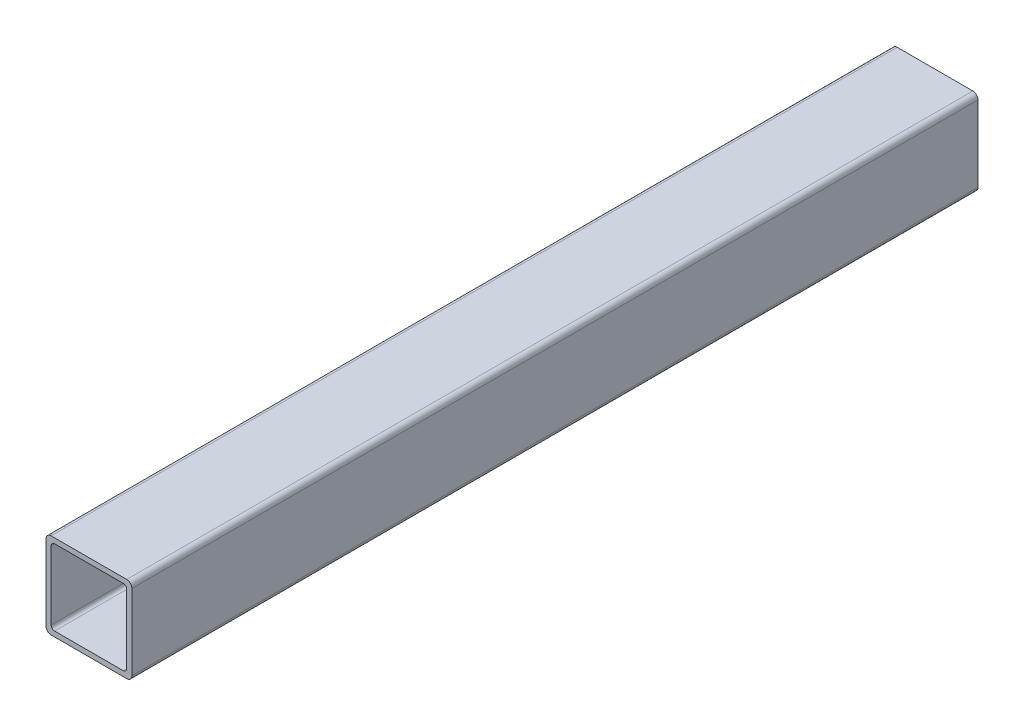
ISO-10303-21;
HEADER;
FILE_DESCRIPTION(('STEP AP214'),'2;1');
FILE_NAME('part.step','',(''),(''),'','','');
FILE_SCHEMA(('AUTOMOTIVE_DESIGN { 1 0 10303 214 1 1 1 1 }'));
ENDSEC;
DATA;
#1=APPLICATION_CONTEXT('core data for automotive mechanical design processes');
#2=APPLICATION_PROTOCOL_DEFINITION('international standard','automotive_design',2000,#1);
#3=PRODUCT_CONTEXT('',#1,'mechanical');
#4=PRODUCT('Part','Part','',(#3));
#5=PRODUCT_RELATED_PRODUCT_CATEGORY('part','',(#4));
#6=PRODUCT_DEFINITION_FORMATION('','',#4);
#7=PRODUCT_DEFINITION_CONTEXT('part definition',#1,'design');
#8=PRODUCT_DEFINITION('design','',#6,#7);
#9=PRODUCT_DEFINITION_SHAPE('','',#8);
#10=(LENGTH_UNIT() NAMED_UNIT(*) SI_UNIT(.MILLI.,.METRE.));
#11=(NAMED_UNIT(*) PLANE_ANGLE_UNIT() SI_UNIT($,.RADIAN.));
#12=(NAMED_UNIT(*) SI_UNIT($,.STERADIAN.) SOLID_ANGLE_UNIT());
#13=UNCERTAINTY_MEASURE_WITH_UNIT(LENGTH_MEASURE(1.E-05),#10,'distance_accuracy_value','');
#14=(GEOMETRIC_REPRESENTATION_CONTEXT(3) GLOBAL_UNCERTAINTY_ASSIGNED_CONTEXT((#13)) GLOBAL_UNIT_ASSIGNED_CONTEXT((#10,
#11,#12)) REPRESENTATION_CONTEXT('',''));
#15=CARTESIAN_POINT('',(0.,0.,0.));
#16=DIRECTION('',(0.,0.,1.));
#17=DIRECTION('',(1.,0.,0.));
#18=AXIS2_PLACEMENT_3D('',#15,#16,#17);
#19=CARTESIAN_POINT('',(-22.,3.,-492.500000000008));
#20=DIRECTION('',(0.,0.,1.));
#21=DIRECTION('',(1.,0.,0.));
#22=AXIS2_PLACEMENT_3D('',#19,#20,#21);
#23=CYLINDRICAL_SURFACE('',#22,3.);
#24=CARTESIAN_POINT('',(-22.,3.,0.));
#25=DIRECTION('',(0.,0.,1.));
#26=DIRECTION('',(1.,0.,0.));
#27=AXIS2_PLACEMENT_3D('',#24,#25,#26);
#28=CIRCLE('',#27,3.);
#29=CARTESIAN_POINT('',(-25.,3.,0.));
#30=VERTEX_POINT('',#29);
#31=CARTESIAN_POINT('',(-22.,0.,0.));
#32=VERTEX_POINT('',#31);
#33=EDGE_CURVE('E205',#30,#32,#28,.T.);
#34=ORIENTED_EDGE('',*,*,#33,.F.);
#35=DIRECTION('',(0.,0.,1.));
#36=VECTOR('',#35,1.);
#37=CARTESIAN_POINT('',(-25.,3.,-492.500000000008));
#38=LINE('',#37,#36);
#39=CARTESIAN_POINT('',(-25.,3.,-492.500000000008));
#40=VERTEX_POINT('',#39);
#41=EDGE_CURVE('E11',#40,#30,#38,.T.);
#42=ORIENTED_EDGE('',*,*,#41,.F.);
#43=CARTESIAN_POINT('',(-22.,3.,-492.500000000008));
#44=DIRECTION('',(0.,0.,1.));
#45=DIRECTION('',(1.,0.,0.));
#46=AXIS2_PLACEMENT_3D('',#43,#44,#45);
#47=CIRCLE('',#46,3.);
#48=CARTESIAN_POINT('',(-22.,0.,-492.500000000008));
#49=VERTEX_POINT('',#48);
#50=EDGE_CURVE('E217',#40,#49,#47,.T.);
#51=ORIENTED_EDGE('',*,*,#50,.T.);
#52=DIRECTION('',(0.,0.,1.));
#53=VECTOR('',#52,1.);
#54=CARTESIAN_POINT('',(-22.,0.,-492.500000000008));
#55=LINE('',#54,#53);
#56=EDGE_CURVE('E38',#49,#32,#55,.T.);
#57=ORIENTED_EDGE('',*,*,#56,.T.);
#58=EDGE_LOOP('',(#34,#42,#51,#57));
#59=FACE_BOUND('',#58,.T.);
#60=ADVANCED_FACE('F35',(#59),#23,.T.);
#61=CARTESIAN_POINT('',(-25.,47.,-492.500000000008));
#62=DIRECTION('',(-1.,0.,0.));
#63=DIRECTION('',(0.,0.,1.));
#64=AXIS2_PLACEMENT_3D('',#61,#62,#63);
#65=PLANE('',#64);
#66=DIRECTION('',(0.,-1.,0.));
#67=VECTOR('',#66,1.);
#68=CARTESIAN_POINT('',(-25.,47.,0.));
#69=LINE('',#68,#67);
#70=CARTESIAN_POINT('',(-25.,47.,0.));
#71=VERTEX_POINT('',#70);
#72=EDGE_CURVE('E221',#71,#30,#69,.T.);
#73=ORIENTED_EDGE('',*,*,#72,.F.);
#74=DIRECTION('',(0.,0.,1.));
#75=VECTOR('',#74,1.);
#76=CARTESIAN_POINT('',(-25.,47.,-492.500000000008));
#77=LINE('',#76,#75);
#78=CARTESIAN_POINT('',(-25.,47.,-492.500000000008));
#79=VERTEX_POINT('',#78);
#80=EDGE_CURVE('E43',#79,#71,#77,.T.);
#81=ORIENTED_EDGE('',*,*,#80,.F.);
#82=DIRECTION('',(0.,-1.,0.));
#83=VECTOR('',#82,1.);
#84=CARTESIAN_POINT('',(-25.,47.,-492.500000000008));
#85=LINE('',#84,#83);
#86=EDGE_CURVE('E239',#79,#40,#85,.T.);
#87=ORIENTED_EDGE('',*,*,#86,.T.);
#88=ORIENTED_EDGE('',*,*,#41,.T.);
#89=EDGE_LOOP('',(#73,#81,#87,#88));
#90=FACE_BOUND('',#89,.T.);
#91=ADVANCED_FACE('F286',(#90),#65,.T.);
#92=CARTESIAN_POINT('',(-22.,47.,-492.500000000008));
#93=DIRECTION('',(0.,0.,1.));
#94=DIRECTION('',(1.,0.,0.));
#95=AXIS2_PLACEMENT_3D('',#92,#93,#94);
#96=CYLINDRICAL_SURFACE('',#95,3.00000000000001);
#97=CARTESIAN_POINT('',(-22.,47.,0.));
#98=DIRECTION('',(0.,0.,1.));
#99=DIRECTION('',(1.,0.,0.));
#100=AXIS2_PLACEMENT_3D('',#97,#98,#99);
#101=CIRCLE('',#100,3.00000000000001);
#102=CARTESIAN_POINT('',(-22.,50.,0.));
#103=VERTEX_POINT('',#102);
#104=EDGE_CURVE('E259',#103,#71,#101,.T.);
#105=ORIENTED_EDGE('',*,*,#104,.F.);
#106=DIRECTION('',(0.,0.,1.));
#107=VECTOR('',#106,1.);
#108=CARTESIAN_POINT('',(-22.,50.,-492.500000000008));
#109=LINE('',#108,#107);
#110=CARTESIAN_POINT('',(-22.,50.,-492.500000000008));
#111=VERTEX_POINT('',#110);
#112=EDGE_CURVE('E265',#111,#103,#109,.T.);
#113=ORIENTED_EDGE('',*,*,#112,.F.);
#114=CARTESIAN_POINT('',(-22.,47.,-492.500000000008));
#115=DIRECTION('',(0.,0.,1.));
#116=DIRECTION('',(1.,0.,0.));
#117=AXIS2_PLACEMENT_3D('',#114,#115,#116);
#118=CIRCLE('',#117,3.00000000000001);
#119=EDGE_CURVE('E236',#111,#79,#118,.T.);
#120=ORIENTED_EDGE('',*,*,#119,.T.);
#121=ORIENTED_EDGE('',*,*,#80,.T.);
#122=EDGE_LOOP('',(#105,#113,#120,#121));
#123=FACE_BOUND('',#122,.T.);
#124=ADVANCED_FACE('F305',(#123),#96,.T.);
#125=CARTESIAN_POINT('',(-22.,50.,-492.500000000008));
#126=DIRECTION('',(0.,1.,0.));
#127=DIRECTION('',(0.,0.,1.));
#128=AXIS2_PLACEMENT_3D('',#125,#126,#127);
#129=PLANE('',#128);
#130=DIRECTION('',(-1.,0.,0.));
#131=VECTOR('',#130,1.);
#132=CARTESIAN_POINT('',(-22.,50.,0.));
#133=LINE('',#132,#131);
#134=CARTESIAN_POINT('',(22.,50.,0.));
#135=VERTEX_POINT('',#134);
#136=EDGE_CURVE('E256',#135,#103,#133,.T.);
#137=ORIENTED_EDGE('',*,*,#136,.F.);
#138=DIRECTION('',(0.,0.,1.));
#139=VECTOR('',#138,1.);
#140=CARTESIAN_POINT('',(22.,50.,-492.500000000008));
#141=LINE('',#140,#139);
#142=CARTESIAN_POINT('',(22.,50.,-492.500000000008));
#143=VERTEX_POINT('',#142);
#144=EDGE_CURVE('E267',#143,#135,#141,.T.);
#145=ORIENTED_EDGE('',*,*,#144,.F.);
#146=DIRECTION('',(-1.,0.,0.));
#147=VECTOR('',#146,1.);
#148=CARTESIAN_POINT('',(-22.,50.,-492.500000000008));
#149=LINE('',#148,#147);
#150=EDGE_CURVE('E233',#143,#111,#149,.T.);
#151=ORIENTED_EDGE('',*,*,#150,.T.);
#152=ORIENTED_EDGE('',*,*,#112,.T.);
#153=EDGE_LOOP('',(#137,#145,#151,#152));
#154=FACE_BOUND('',#153,.T.);
#155=ADVANCED_FACE('F303',(#154),#129,.T.);
#156=CARTESIAN_POINT('',(22.,47.,-492.500000000008));
#157=DIRECTION('',(0.,0.,1.));
#158=DIRECTION('',(1.,0.,0.));
#159=AXIS2_PLACEMENT_3D('',#156,#157,#158);
#160=CYLINDRICAL_SURFACE('',#159,3.00000000000001);
#161=CARTESIAN_POINT('',(22.,47.,0.));
#162=DIRECTION('',(0.,0.,1.));
#163=DIRECTION('',(-1.,0.,0.));
#164=AXIS2_PLACEMENT_3D('',#161,#162,#163);
#165=CIRCLE('',#164,3.00000000000001);
#166=CARTESIAN_POINT('',(25.,47.,0.));
#167=VERTEX_POINT('',#166);
#168=EDGE_CURVE('E253',#167,#135,#165,.T.);
#169=ORIENTED_EDGE('',*,*,#168,.F.);
#170=DIRECTION('',(0.,0.,1.));
#171=VECTOR('',#170,1.);
#172=CARTESIAN_POINT('',(25.,47.,-492.500000000008));
#173=LINE('',#172,#171);
#174=CARTESIAN_POINT('',(25.,47.,-492.500000000008));
#175=VERTEX_POINT('',#174);
#176=EDGE_CURVE('E269',#175,#167,#173,.T.);
#177=ORIENTED_EDGE('',*,*,#176,.F.);
#178=CARTESIAN_POINT('',(22.,47.,-492.500000000008));
#179=DIRECTION('',(0.,0.,1.));
#180=DIRECTION('',(-1.,0.,0.));
#181=AXIS2_PLACEMENT_3D('',#178,#179,#180);
#182=CIRCLE('',#181,3.00000000000001);
#183=EDGE_CURVE('E230',#175,#143,#182,.T.);
#184=ORIENTED_EDGE('',*,*,#183,.T.);
#185=ORIENTED_EDGE('',*,*,#144,.T.);
#186=EDGE_LOOP('',(#169,#177,#184,#185));
#187=FACE_BOUND('',#186,.T.);
#188=ADVANCED_FACE('F299',(#187),#160,.T.);
#189=CARTESIAN_POINT('',(25.,47.,-492.500000000008));
#190=DIRECTION('',(1.,0.,0.));
#191=DIRECTION('',(0.,0.,-1.));
#192=AXIS2_PLACEMENT_3D('',#189,#190,#191);
#193=PLANE('',#192);
#194=DIRECTION('',(0.,1.,0.));
#195=VECTOR('',#194,1.);
#196=CARTESIAN_POINT('',(25.,47.,0.));
#197=LINE('',#196,#195);
#198=CARTESIAN_POINT('',(25.,3.,0.));
#199=VERTEX_POINT('',#198);
#200=EDGE_CURVE('E250',#199,#167,#197,.T.);
#201=ORIENTED_EDGE('',*,*,#200,.F.);
#202=DIRECTION('',(0.,0.,1.));
#203=VECTOR('',#202,1.);
#204=CARTESIAN_POINT('',(25.,3.,-492.500000000008));
#205=LINE('',#204,#203);
#206=CARTESIAN_POINT('',(25.,3.,-492.500000000008));
#207=VERTEX_POINT('',#206);
#208=EDGE_CURVE('E271',#207,#199,#205,.T.);
#209=ORIENTED_EDGE('',*,*,#208,.F.);
#210=DIRECTION('',(0.,1.,0.));
#211=VECTOR('',#210,1.);
#212=CARTESIAN_POINT('',(25.,47.,-492.500000000008));
#213=LINE('',#212,#211);
#214=EDGE_CURVE('E227',#207,#175,#213,.T.);
#215=ORIENTED_EDGE('',*,*,#214,.T.);
#216=ORIENTED_EDGE('',*,*,#176,.T.);
#217=EDGE_LOOP('',(#201,#209,#215,#216));
#218=FACE_BOUND('',#217,.T.);
#219=ADVANCED_FACE('F297',(#218),#193,.T.);
#220=CARTESIAN_POINT('',(22.,3.,-492.500000000008));
#221=DIRECTION('',(0.,0.,1.));
#222=DIRECTION('',(1.,0.,0.));
#223=AXIS2_PLACEMENT_3D('',#220,#221,#222);
#224=CYLINDRICAL_SURFACE('',#223,3.);
#225=CARTESIAN_POINT('',(22.,3.,0.));
#226=DIRECTION('',(0.,0.,1.));
#227=DIRECTION('',(1.,0.,0.));
#228=AXIS2_PLACEMENT_3D('',#225,#226,#227);
#229=CIRCLE('',#228,3.);
#230=CARTESIAN_POINT('',(22.,0.,0.));
#231=VERTEX_POINT('',#230);
#232=EDGE_CURVE('E247',#231,#199,#229,.T.);
#233=ORIENTED_EDGE('',*,*,#232,.F.);
#234=DIRECTION('',(0.,0.,1.));
#235=VECTOR('',#234,1.);
#236=CARTESIAN_POINT('',(22.,0.,-492.500000000008));
#237=LINE('',#236,#235);
#238=CARTESIAN_POINT('',(22.,0.,-492.500000000008));
#239=VERTEX_POINT('',#238);
#240=EDGE_CURVE('E272',#239,#231,#237,.T.);
#241=ORIENTED_EDGE('',*,*,#240,.F.);
#242=CARTESIAN_POINT('',(22.,3.,-492.500000000008));
#243=DIRECTION('',(0.,0.,1.));
#244=DIRECTION('',(1.,0.,0.));
#245=AXIS2_PLACEMENT_3D('',#242,#243,#244);
#246=CIRCLE('',#245,3.);
#247=EDGE_CURVE('E224',#239,#207,#246,.T.);
#248=ORIENTED_EDGE('',*,*,#247,.T.);
#249=ORIENTED_EDGE('',*,*,#208,.T.);
#250=EDGE_LOOP('',(#233,#241,#248,#249));
#251=FACE_BOUND('',#250,.T.);
#252=ADVANCED_FACE('F293',(#251),#224,.T.);
#253=CARTESIAN_POINT('',(-22.,0.,-492.500000000008));
#254=DIRECTION('',(0.,-1.,0.));
#255=DIRECTION('',(0.,0.,-1.));
#256=AXIS2_PLACEMENT_3D('',#253,#254,#255);
#257=PLANE('',#256);
#258=DIRECTION('',(1.,0.,0.));
#259=VECTOR('',#258,1.);
#260=CARTESIAN_POINT('',(-22.,0.,0.));
#261=LINE('',#260,#259);
#262=EDGE_CURVE('E244',#32,#231,#261,.T.);
#263=ORIENTED_EDGE('',*,*,#262,.F.);
#264=ORIENTED_EDGE('',*,*,#56,.F.);
#265=DIRECTION('',(1.,0.,0.));
#266=VECTOR('',#265,1.);
#267=CARTESIAN_POINT('',(-22.,0.,-492.500000000008));
#268=LINE('',#267,#266);
#269=EDGE_CURVE('E220',#49,#239,#268,.T.);
#270=ORIENTED_EDGE('',*,*,#269,.T.);
#271=ORIENTED_EDGE('',*,*,#240,.T.);
#272=EDGE_LOOP('',(#263,#264,#270,#271));
#273=FACE_BOUND('',#272,.T.);
#274=ADVANCED_FACE('F280',(#273),#257,.T.);
#275=CARTESIAN_POINT('',(-22.,3.,-492.500000000008));
#276=DIRECTION('',(0.,0.,1.));
#277=DIRECTION('',(1.,0.,0.));
#278=AXIS2_PLACEMENT_3D('',#275,#276,#277);
#279=PLANE('',#278);
#280=DIRECTION('',(0.,-1.,0.));
#281=VECTOR('',#280,1.);
#282=CARTESIAN_POINT('',(-22.,45.,-492.500000000008));
#283=LINE('',#282,#281);
#284=CARTESIAN_POINT('',(-22.,45.,-492.500000000008));
#285=VERTEX_POINT('',#284);
#286=CARTESIAN_POINT('',(-22.,5.,-492.500000000008));
#287=VERTEX_POINT('',#286);
#288=EDGE_CURVE('E156',#285,#287,#283,.T.);
#289=ORIENTED_EDGE('',*,*,#288,.T.);
#290=CARTESIAN_POINT('',(-20.,5.,-492.500000000008));
#291=DIRECTION('',(0.,0.,1.));
#292=DIRECTION('',(1.,0.,0.));
#293=AXIS2_PLACEMENT_3D('',#290,#291,#292);
#294=CIRCLE('',#293,2.);
#295=CARTESIAN_POINT('',(-20.,3.,-492.500000000008));
#296=VERTEX_POINT('',#295);
#297=EDGE_CURVE('E150',#287,#296,#294,.T.);
#298=ORIENTED_EDGE('',*,*,#297,.T.);
#299=DIRECTION('',(1.,0.,0.));
#300=VECTOR('',#299,1.);
#301=CARTESIAN_POINT('',(-20.,3.,-492.500000000008));
#302=LINE('',#301,#300);
#303=CARTESIAN_POINT('',(20.,3.,-492.500000000008));
#304=VERTEX_POINT('',#303);
#305=EDGE_CURVE('E159',#296,#304,#302,.T.);
#306=ORIENTED_EDGE('',*,*,#305,.T.);
#307=CARTESIAN_POINT('',(20.,5.,-492.500000000008));
#308=DIRECTION('',(0.,0.,1.));
#309=DIRECTION('',(1.,0.,0.));
#310=AXIS2_PLACEMENT_3D('',#307,#308,#309);
#311=CIRCLE('',#310,2.);
#312=CARTESIAN_POINT('',(22.,5.,-492.500000000008));
#313=VERTEX_POINT('',#312);
#314=EDGE_CURVE('E51',#304,#313,#311,.T.);
#315=ORIENTED_EDGE('',*,*,#314,.T.);
#316=DIRECTION('',(0.,1.,0.));
#317=VECTOR('',#316,1.);
#318=CARTESIAN_POINT('',(22.,45.,-492.500000000008));
#319=LINE('',#318,#317);
#320=CARTESIAN_POINT('',(22.,45.,-492.500000000008));
#321=VERTEX_POINT('',#320);
#322=EDGE_CURVE('E174',#313,#321,#319,.T.);
#323=ORIENTED_EDGE('',*,*,#322,.T.);
#324=CARTESIAN_POINT('',(20.,45.,-492.500000000008));
#325=DIRECTION('',(0.,0.,1.));
#326=DIRECTION('',(-1.,0.,0.));
#327=AXIS2_PLACEMENT_3D('',#324,#325,#326);
#328=CIRCLE('',#327,2.);
#329=CARTESIAN_POINT('',(20.,47.,-492.500000000008));
#330=VERTEX_POINT('',#329);
#331=EDGE_CURVE('E177',#321,#330,#328,.T.);
#332=ORIENTED_EDGE('',*,*,#331,.T.);
#333=DIRECTION('',(-1.,0.,0.));
#334=VECTOR('',#333,1.);
#335=CARTESIAN_POINT('',(-20.,47.,-492.500000000008));
#336=LINE('',#335,#334);
#337=CARTESIAN_POINT('',(-20.,47.,-492.500000000008));
#338=VERTEX_POINT('',#337);
#339=EDGE_CURVE('E180',#330,#338,#336,.T.);
#340=ORIENTED_EDGE('',*,*,#339,.T.);
#341=CARTESIAN_POINT('',(-20.,45.,-492.500000000008));
#342=DIRECTION('',(0.,0.,1.));
#343=DIRECTION('',(1.,0.,0.));
#344=AXIS2_PLACEMENT_3D('',#341,#342,#343);
#345=CIRCLE('',#344,2.);
#346=EDGE_CURVE('E183',#338,#285,#345,.T.);
#347=ORIENTED_EDGE('',*,*,#346,.T.);
#348=EDGE_LOOP('',(#289,#298,#306,#315,#323,#332,#340,#347));
#349=FACE_BOUND('',#348,.T.);
#350=ORIENTED_EDGE('',*,*,#50,.F.);
#351=ORIENTED_EDGE('',*,*,#86,.F.);
#352=ORIENTED_EDGE('',*,*,#119,.F.);
#353=ORIENTED_EDGE('',*,*,#150,.F.);
#354=ORIENTED_EDGE('',*,*,#183,.F.);
#355=ORIENTED_EDGE('',*,*,#214,.F.);
#356=ORIENTED_EDGE('',*,*,#247,.F.);
#357=ORIENTED_EDGE('',*,*,#269,.F.);
#358=EDGE_LOOP('',(#350,#351,#352,#353,#354,#355,#356,#357));
#359=FACE_BOUND('',#358,.T.);
#360=ADVANCED_FACE('F163',(#349,#359),#279,.F.);
#361=CARTESIAN_POINT('',(-22.,3.,0.));
#362=DIRECTION('',(0.,0.,1.));
#363=DIRECTION('',(1.,0.,0.));
#364=AXIS2_PLACEMENT_3D('',#361,#362,#363);
#365=PLANE('',#364);
#366=CARTESIAN_POINT('',(-20.,5.,0.));
#367=DIRECTION('',(0.,0.,1.));
#368=DIRECTION('',(1.,0.,0.));
#369=AXIS2_PLACEMENT_3D('',#366,#367,#368);
#370=CIRCLE('',#369,2.);
#371=CARTESIAN_POINT('',(-22.,5.,0.));
#372=VERTEX_POINT('',#371);
#373=CARTESIAN_POINT('',(-20.,3.,0.));
#374=VERTEX_POINT('',#373);
#375=EDGE_CURVE('E59',#372,#374,#370,.T.);
#376=ORIENTED_EDGE('',*,*,#375,.F.);
#377=DIRECTION('',(0.,-1.,0.));
#378=VECTOR('',#377,1.);
#379=CARTESIAN_POINT('',(-22.,45.,0.));
#380=LINE('',#379,#378);
#381=CARTESIAN_POINT('',(-22.,45.,0.));
#382=VERTEX_POINT('',#381);
#383=EDGE_CURVE('E167',#382,#372,#380,.T.);
#384=ORIENTED_EDGE('',*,*,#383,.F.);
#385=CARTESIAN_POINT('',(-20.,45.,0.));
#386=DIRECTION('',(0.,0.,1.));
#387=DIRECTION('',(1.,0.,0.));
#388=AXIS2_PLACEMENT_3D('',#385,#386,#387);
#389=CIRCLE('',#388,2.);
#390=CARTESIAN_POINT('',(-20.,47.,0.));
#391=VERTEX_POINT('',#390);
#392=EDGE_CURVE('E170',#391,#382,#389,.T.);
#393=ORIENTED_EDGE('',*,*,#392,.F.);
#394=DIRECTION('',(-1.,0.,0.));
#395=VECTOR('',#394,1.);
#396=CARTESIAN_POINT('',(-20.,47.,0.));
#397=LINE('',#396,#395);
#398=CARTESIAN_POINT('',(20.,47.,0.));
#399=VERTEX_POINT('',#398);
#400=EDGE_CURVE('E198',#399,#391,#397,.T.);
#401=ORIENTED_EDGE('',*,*,#400,.F.);
#402=CARTESIAN_POINT('',(20.,45.,0.));
#403=DIRECTION('',(0.,0.,1.));
#404=DIRECTION('',(-1.,0.,0.));
#405=AXIS2_PLACEMENT_3D('',#402,#403,#404);
#406=CIRCLE('',#405,2.);
#407=CARTESIAN_POINT('',(22.,45.,0.));
#408=VERTEX_POINT('',#407);
#409=EDGE_CURVE('E195',#408,#399,#406,.T.);
#410=ORIENTED_EDGE('',*,*,#409,.F.);
#411=DIRECTION('',(0.,1.,0.));
#412=VECTOR('',#411,1.);
#413=CARTESIAN_POINT('',(22.,45.,0.));
#414=LINE('',#413,#412);
#415=CARTESIAN_POINT('',(22.,5.,0.));
#416=VERTEX_POINT('',#415);
#417=EDGE_CURVE('E192',#416,#408,#414,.T.);
#418=ORIENTED_EDGE('',*,*,#417,.F.);
#419=CARTESIAN_POINT('',(20.,5.,0.));
#420=DIRECTION('',(0.,0.,1.));
#421=DIRECTION('',(1.,0.,0.));
#422=AXIS2_PLACEMENT_3D('',#419,#420,#421);
#423=CIRCLE('',#422,2.);
#424=CARTESIAN_POINT('',(20.,3.,0.));
#425=VERTEX_POINT('',#424);
#426=EDGE_CURVE('E189',#425,#416,#423,.T.);
#427=ORIENTED_EDGE('',*,*,#426,.F.);
#428=DIRECTION('',(1.,0.,0.));
#429=VECTOR('',#428,1.);
#430=CARTESIAN_POINT('',(-20.,3.,0.));
#431=LINE('',#430,#429);
#432=EDGE_CURVE('E187',#374,#425,#431,.T.);
#433=ORIENTED_EDGE('',*,*,#432,.F.);
#434=EDGE_LOOP('',(#376,#384,#393,#401,#410,#418,#427,#433));
#435=FACE_BOUND('',#434,.T.);
#436=ORIENTED_EDGE('',*,*,#33,.T.);
#437=ORIENTED_EDGE('',*,*,#262,.T.);
#438=ORIENTED_EDGE('',*,*,#232,.T.);
#439=ORIENTED_EDGE('',*,*,#200,.T.);
#440=ORIENTED_EDGE('',*,*,#168,.T.);
#441=ORIENTED_EDGE('',*,*,#136,.T.);
#442=ORIENTED_EDGE('',*,*,#104,.T.);
#443=ORIENTED_EDGE('',*,*,#72,.T.);
#444=EDGE_LOOP('',(#436,#437,#438,#439,#440,#441,#442,#443));
#445=FACE_BOUND('',#444,.T.);
#446=ADVANCED_FACE('F282',(#435,#445),#365,.T.);
#447=CARTESIAN_POINT('',(-20.,5.,-492.500000000008));
#448=DIRECTION('',(0.,0.,1.));
#449=DIRECTION('',(1.,0.,0.));
#450=AXIS2_PLACEMENT_3D('',#447,#448,#449);
#451=CYLINDRICAL_SURFACE('',#450,2.);
#452=ORIENTED_EDGE('',*,*,#375,.T.);
#453=DIRECTION('',(0.,0.,1.));
#454=VECTOR('',#453,1.);
#455=CARTESIAN_POINT('',(-20.,3.,-492.500000000008));
#456=LINE('',#455,#454);
#457=EDGE_CURVE('E146',#296,#374,#456,.T.);
#458=ORIENTED_EDGE('',*,*,#457,.F.);
#459=ORIENTED_EDGE('',*,*,#297,.F.);
#460=DIRECTION('',(0.,0.,1.));
#461=VECTOR('',#460,1.);
#462=CARTESIAN_POINT('',(-22.,5.,-492.500000000008));
#463=LINE('',#462,#461);
#464=EDGE_CURVE('E203',#287,#372,#463,.T.);
#465=ORIENTED_EDGE('',*,*,#464,.T.);
#466=EDGE_LOOP('',(#452,#458,#459,#465));
#467=FACE_BOUND('',#466,.T.);
#468=ADVANCED_FACE('F148',(#467),#451,.F.);
#469=CARTESIAN_POINT('',(-22.,45.,-492.500000000008));
#470=DIRECTION('',(-1.,0.,0.));
#471=DIRECTION('',(0.,0.,1.));
#472=AXIS2_PLACEMENT_3D('',#469,#470,#471);
#473=PLANE('',#472);
#474=ORIENTED_EDGE('',*,*,#383,.T.);
#475=ORIENTED_EDGE('',*,*,#464,.F.);
#476=ORIENTED_EDGE('',*,*,#288,.F.);
#477=DIRECTION('',(0.,0.,1.));
#478=VECTOR('',#477,1.);
#479=CARTESIAN_POINT('',(-22.,45.,-492.500000000008));
#480=LINE('',#479,#478);
#481=EDGE_CURVE('E206',#285,#382,#480,.T.);
#482=ORIENTED_EDGE('',*,*,#481,.T.);
#483=EDGE_LOOP('',(#474,#475,#476,#482));
#484=FACE_BOUND('',#483,.T.);
#485=ADVANCED_FACE('F388',(#484),#473,.F.);
#486=CARTESIAN_POINT('',(-20.,45.,-492.500000000008));
#487=DIRECTION('',(0.,0.,1.));
#488=DIRECTION('',(1.,0.,0.));
#489=AXIS2_PLACEMENT_3D('',#486,#487,#488);
#490=CYLINDRICAL_SURFACE('',#489,2.);
#491=ORIENTED_EDGE('',*,*,#392,.T.);
#492=ORIENTED_EDGE('',*,*,#481,.F.);
#493=ORIENTED_EDGE('',*,*,#346,.F.);
#494=DIRECTION('',(0.,0.,1.));
#495=VECTOR('',#494,1.);
#496=CARTESIAN_POINT('',(-20.,47.,-492.500000000008));
#497=LINE('',#496,#495);
#498=EDGE_CURVE('E208',#338,#391,#497,.T.);
#499=ORIENTED_EDGE('',*,*,#498,.T.);
#500=EDGE_LOOP('',(#491,#492,#493,#499));
#501=FACE_BOUND('',#500,.T.);
#502=ADVANCED_FACE('F397',(#501),#490,.F.);
#503=CARTESIAN_POINT('',(-20.,47.,-492.500000000008));
#504=DIRECTION('',(0.,1.,0.));
#505=DIRECTION('',(0.,0.,1.));
#506=AXIS2_PLACEMENT_3D('',#503,#504,#505);
#507=PLANE('',#506);
#508=ORIENTED_EDGE('',*,*,#400,.T.);
#509=ORIENTED_EDGE('',*,*,#498,.F.);
#510=ORIENTED_EDGE('',*,*,#339,.F.);
#511=DIRECTION('',(0.,0.,1.));
#512=VECTOR('',#511,1.);
#513=CARTESIAN_POINT('',(20.,47.,-492.500000000008));
#514=LINE('',#513,#512);
#515=EDGE_CURVE('E210',#330,#399,#514,.T.);
#516=ORIENTED_EDGE('',*,*,#515,.T.);
#517=EDGE_LOOP('',(#508,#509,#510,#516));
#518=FACE_BOUND('',#517,.T.);
#519=ADVANCED_FACE('F407',(#518),#507,.F.);
#520=CARTESIAN_POINT('',(20.,45.,-492.500000000008));
#521=DIRECTION('',(0.,0.,1.));
#522=DIRECTION('',(1.,0.,0.));
#523=AXIS2_PLACEMENT_3D('',#520,#521,#522);
#524=CYLINDRICAL_SURFACE('',#523,2.);
#525=ORIENTED_EDGE('',*,*,#409,.T.);
#526=ORIENTED_EDGE('',*,*,#515,.F.);
#527=ORIENTED_EDGE('',*,*,#331,.F.);
#528=DIRECTION('',(0.,0.,1.));
#529=VECTOR('',#528,1.);
#530=CARTESIAN_POINT('',(22.,45.,-492.500000000008));
#531=LINE('',#530,#529);
#532=EDGE_CURVE('E212',#321,#408,#531,.T.);
#533=ORIENTED_EDGE('',*,*,#532,.T.);
#534=EDGE_LOOP('',(#525,#526,#527,#533));
#535=FACE_BOUND('',#534,.T.);
#536=ADVANCED_FACE('F417',(#535),#524,.F.);
#537=CARTESIAN_POINT('',(22.,45.,-492.500000000008));
#538=DIRECTION('',(1.,0.,0.));
#539=DIRECTION('',(0.,0.,-1.));
#540=AXIS2_PLACEMENT_3D('',#537,#538,#539);
#541=PLANE('',#540);
#542=ORIENTED_EDGE('',*,*,#417,.T.);
#543=ORIENTED_EDGE('',*,*,#532,.F.);
#544=ORIENTED_EDGE('',*,*,#322,.F.);
#545=DIRECTION('',(0.,0.,1.));
#546=VECTOR('',#545,1.);
#547=CARTESIAN_POINT('',(22.,5.,-492.500000000008));
#548=LINE('',#547,#546);
#549=EDGE_CURVE('E214',#313,#416,#548,.T.);
#550=ORIENTED_EDGE('',*,*,#549,.T.);
#551=EDGE_LOOP('',(#542,#543,#544,#550));
#552=FACE_BOUND('',#551,.T.);
#553=ADVANCED_FACE('F427',(#552),#541,.F.);
#554=CARTESIAN_POINT('',(20.,5.,-492.500000000008));
#555=DIRECTION('',(0.,0.,1.));
#556=DIRECTION('',(1.,0.,0.));
#557=AXIS2_PLACEMENT_3D('',#554,#555,#556);
#558=CYLINDRICAL_SURFACE('',#557,2.);
#559=ORIENTED_EDGE('',*,*,#426,.T.);
#560=ORIENTED_EDGE('',*,*,#549,.F.);
#561=ORIENTED_EDGE('',*,*,#314,.F.);
#562=DIRECTION('',(0.,0.,1.));
#563=VECTOR('',#562,1.);
#564=CARTESIAN_POINT('',(20.,3.,-492.500000000008));
#565=LINE('',#564,#563);
#566=EDGE_CURVE('E155',#304,#425,#565,.T.);
#567=ORIENTED_EDGE('',*,*,#566,.T.);
#568=EDGE_LOOP('',(#559,#560,#561,#567));
#569=FACE_BOUND('',#568,.T.);
#570=ADVANCED_FACE('F437',(#569),#558,.F.);
#571=CARTESIAN_POINT('',(-20.,3.,-492.500000000008));
#572=DIRECTION('',(0.,-1.,0.));
#573=DIRECTION('',(0.,0.,-1.));
#574=AXIS2_PLACEMENT_3D('',#571,#572,#573);
#575=PLANE('',#574);
#576=ORIENTED_EDGE('',*,*,#432,.T.);
#577=ORIENTED_EDGE('',*,*,#566,.F.);
#578=ORIENTED_EDGE('',*,*,#305,.F.);
#579=ORIENTED_EDGE('',*,*,#457,.T.);
#580=EDGE_LOOP('',(#576,#577,#578,#579));
#581=FACE_BOUND('',#580,.T.);
#582=ADVANCED_FACE('F160',(#581),#575,.F.);
#583=CLOSED_SHELL('',(#60,#91,#124,#155,#188,#219,#252,#274,#360,#446,#468,#485,#502,#519,#536,
#553,#570,#582));
#584=MANIFOLD_SOLID_BREP('B2',#583);
#585=ADVANCED_BREP_SHAPE_REPRESENTATION('',(#18,#584),#14);
#586=SHAPE_DEFINITION_REPRESENTATION(#9,#585);
ENDSEC;
END-ISO-10303-21;
